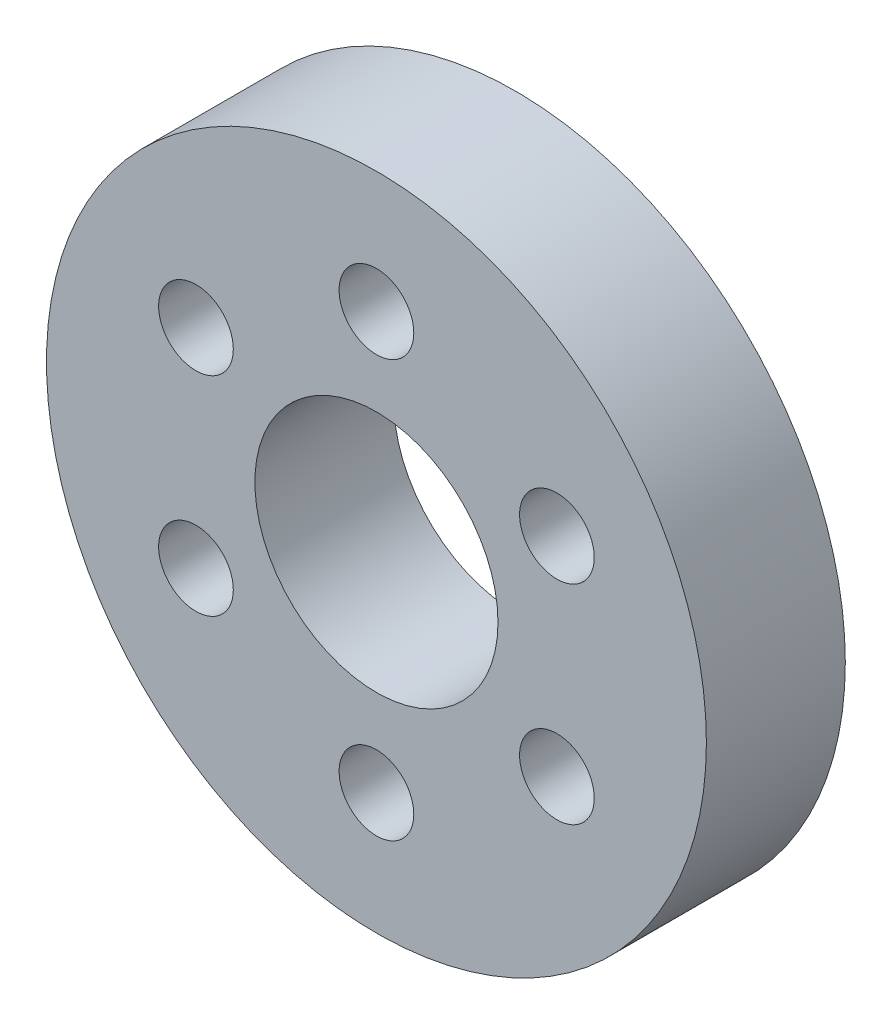
ISO-10303-21;
HEADER;
FILE_DESCRIPTION(('STEP AP214'),'2;1');
FILE_NAME('part.step','',(''),(''),'','','');
FILE_SCHEMA(('AUTOMOTIVE_DESIGN { 1 0 10303 214 1 1 1 1 }'));
ENDSEC;
DATA;
#1=APPLICATION_CONTEXT('core data for automotive mechanical design processes');
#2=APPLICATION_PROTOCOL_DEFINITION('international standard','automotive_design',2000,#1);
#3=PRODUCT_CONTEXT('',#1,'mechanical');
#4=PRODUCT('Part','Part','',(#3));
#5=PRODUCT_RELATED_PRODUCT_CATEGORY('part','',(#4));
#6=PRODUCT_DEFINITION_FORMATION('','',#4);
#7=PRODUCT_DEFINITION_CONTEXT('part definition',#1,'design');
#8=PRODUCT_DEFINITION('design','',#6,#7);
#9=PRODUCT_DEFINITION_SHAPE('','',#8);
#10=(LENGTH_UNIT() NAMED_UNIT(*) SI_UNIT(.MILLI.,.METRE.));
#11=(NAMED_UNIT(*) PLANE_ANGLE_UNIT() SI_UNIT($,.RADIAN.));
#12=(NAMED_UNIT(*) SI_UNIT($,.STERADIAN.) SOLID_ANGLE_UNIT());
#13=UNCERTAINTY_MEASURE_WITH_UNIT(LENGTH_MEASURE(1.E-05),#10,'distance_accuracy_value','');
#14=(GEOMETRIC_REPRESENTATION_CONTEXT(3) GLOBAL_UNCERTAINTY_ASSIGNED_CONTEXT((#13)) GLOBAL_UNIT_ASSIGNED_CONTEXT((#10,
#11,#12)) REPRESENTATION_CONTEXT('',''));
#15=CARTESIAN_POINT('',(0.,0.,0.));
#16=DIRECTION('',(0.,0.,1.));
#17=DIRECTION('',(1.,0.,0.));
#18=AXIS2_PLACEMENT_3D('',#15,#16,#17);
#19=CARTESIAN_POINT('',(0.,-1.48735469643318,8.));
#20=DIRECTION('',(0.,0.,1.));
#21=DIRECTION('',(1.,0.,0.));
#22=AXIS2_PLACEMENT_3D('',#19,#20,#21);
#23=PLANE('',#22);
#24=CARTESIAN_POINT('',(-10.3923048454133,-7.48735469643319,8.));
#25=DIRECTION('',(0.,0.,1.));
#26=DIRECTION('',(1.,0.,0.));
#27=AXIS2_PLACEMENT_3D('',#24,#25,#26);
#28=CIRCLE('',#27,2.14999999999954);
#29=CARTESIAN_POINT('',(-8.24230484541372,-7.48735469643319,8.));
#30=VERTEX_POINT('',#29);
#31=EDGE_CURVE('E78',#30,#30,#28,.T.);
#32=ORIENTED_EDGE('',*,*,#31,.F.);
#33=EDGE_LOOP('',(#32));
#34=FACE_BOUND('',#33,.T.);
#35=CARTESIAN_POINT('',(10.3923048454133,-7.48735469643318,8.));
#36=DIRECTION('',(0.,0.,1.));
#37=DIRECTION('',(1.,0.,0.));
#38=AXIS2_PLACEMENT_3D('',#35,#36,#37);
#39=CIRCLE('',#38,2.14999999999966);
#40=CARTESIAN_POINT('',(12.5423048454129,-7.48735469643318,8.));
#41=VERTEX_POINT('',#40);
#42=EDGE_CURVE('E69',#41,#41,#39,.T.);
#43=ORIENTED_EDGE('',*,*,#42,.F.);
#44=EDGE_LOOP('',(#43));
#45=FACE_BOUND('',#44,.T.);
#46=CARTESIAN_POINT('',(0.,10.5126453035668,8.));
#47=DIRECTION('',(0.,0.,1.));
#48=DIRECTION('',(1.,0.,0.));
#49=AXIS2_PLACEMENT_3D('',#46,#47,#48);
#50=CIRCLE('',#49,2.15);
#51=CARTESIAN_POINT('',(2.15,10.5126453035668,8.));
#52=VERTEX_POINT('',#51);
#53=EDGE_CURVE('E54',#52,#52,#50,.T.);
#54=ORIENTED_EDGE('',*,*,#53,.F.);
#55=EDGE_LOOP('',(#54));
#56=FACE_BOUND('',#55,.T.);
#57=CARTESIAN_POINT('',(0.,-1.48735469643318,8.));
#58=DIRECTION('',(0.,0.,1.));
#59=DIRECTION('',(1.,0.,0.));
#60=AXIS2_PLACEMENT_3D('',#57,#58,#59);
#61=CIRCLE('',#60,19.);
#62=CARTESIAN_POINT('',(19.,-1.48735469643318,8.));
#63=VERTEX_POINT('',#62);
#64=EDGE_CURVE('E10',#63,#63,#61,.T.);
#65=ORIENTED_EDGE('',*,*,#64,.T.);
#66=EDGE_LOOP('',(#65));
#67=FACE_BOUND('',#66,.T.);
#68=CARTESIAN_POINT('',(0.,-1.48735469643318,8.));
#69=DIRECTION('',(0.,0.,1.));
#70=DIRECTION('',(1.,0.,0.));
#71=AXIS2_PLACEMENT_3D('',#68,#69,#70);
#72=CIRCLE('',#71,7.);
#73=CARTESIAN_POINT('',(7.,-1.48735469643318,8.));
#74=VERTEX_POINT('',#73);
#75=EDGE_CURVE('E49',#74,#74,#72,.T.);
#76=ORIENTED_EDGE('',*,*,#75,.F.);
#77=EDGE_LOOP('',(#76));
#78=FACE_BOUND('',#77,.T.);
#79=CARTESIAN_POINT('',(10.3923048454134,4.51264530356709,8.));
#80=DIRECTION('',(0.,0.,1.));
#81=DIRECTION('',(1.,0.,0.));
#82=AXIS2_PLACEMENT_3D('',#79,#80,#81);
#83=CIRCLE('',#82,2.15);
#84=CARTESIAN_POINT('',(12.5423048454134,4.51264530356709,8.));
#85=VERTEX_POINT('',#84);
#86=EDGE_CURVE('E61',#85,#85,#83,.T.);
#87=ORIENTED_EDGE('',*,*,#86,.F.);
#88=EDGE_LOOP('',(#87));
#89=FACE_BOUND('',#88,.T.);
#90=CARTESIAN_POINT('',(0.,-13.4873546964332,8.));
#91=DIRECTION('',(0.,0.,1.));
#92=DIRECTION('',(1.,0.,0.));
#93=AXIS2_PLACEMENT_3D('',#90,#91,#92);
#94=CIRCLE('',#93,2.14999999999944);
#95=CARTESIAN_POINT('',(2.14999999999944,-13.4873546964332,8.));
#96=VERTEX_POINT('',#95);
#97=EDGE_CURVE('E71',#96,#96,#94,.T.);
#98=ORIENTED_EDGE('',*,*,#97,.F.);
#99=EDGE_LOOP('',(#98));
#100=FACE_BOUND('',#99,.T.);
#101=CARTESIAN_POINT('',(-10.392304845413,4.51264530356665,8.));
#102=DIRECTION('',(0.,0.,1.));
#103=DIRECTION('',(1.,0.,0.));
#104=AXIS2_PLACEMENT_3D('',#101,#102,#103);
#105=CIRCLE('',#104,2.15);
#106=CARTESIAN_POINT('',(-8.24230484541303,4.51264530356665,8.));
#107=VERTEX_POINT('',#106);
#108=EDGE_CURVE('E83',#107,#107,#105,.T.);
#109=ORIENTED_EDGE('',*,*,#108,.F.);
#110=EDGE_LOOP('',(#109));
#111=FACE_BOUND('',#110,.T.);
#112=ADVANCED_FACE('F39',(#34,#45,#56,#67,#78,#89,#100,#111),#23,.T.);
#113=CARTESIAN_POINT('',(0.,-1.48735469643318,0.));
#114=DIRECTION('',(0.,0.,1.));
#115=DIRECTION('',(1.,0.,0.));
#116=AXIS2_PLACEMENT_3D('',#113,#114,#115);
#117=PLANE('',#116);
#118=CARTESIAN_POINT('',(0.,-1.48735469643318,0.));
#119=DIRECTION('',(0.,0.,1.));
#120=DIRECTION('',(1.,0.,0.));
#121=AXIS2_PLACEMENT_3D('',#118,#119,#120);
#122=CIRCLE('',#121,19.);
#123=CARTESIAN_POINT('',(19.,-1.48735469643318,0.));
#124=VERTEX_POINT('',#123);
#125=EDGE_CURVE('E43',#124,#124,#122,.T.);
#126=ORIENTED_EDGE('',*,*,#125,.F.);
#127=EDGE_LOOP('',(#126));
#128=FACE_BOUND('',#127,.T.);
#129=CARTESIAN_POINT('',(0.,-1.48735469643318,0.));
#130=DIRECTION('',(0.,0.,1.));
#131=DIRECTION('',(1.,0.,0.));
#132=AXIS2_PLACEMENT_3D('',#129,#130,#131);
#133=CIRCLE('',#132,7.);
#134=CARTESIAN_POINT('',(7.,-1.48735469643318,0.));
#135=VERTEX_POINT('',#134);
#136=EDGE_CURVE('E55',#135,#135,#133,.T.);
#137=ORIENTED_EDGE('',*,*,#136,.T.);
#138=EDGE_LOOP('',(#137));
#139=FACE_BOUND('',#138,.T.);
#140=CARTESIAN_POINT('',(0.,10.5126453035668,0.));
#141=DIRECTION('',(0.,0.,1.));
#142=DIRECTION('',(1.,0.,0.));
#143=AXIS2_PLACEMENT_3D('',#140,#141,#142);
#144=CIRCLE('',#143,2.15);
#145=CARTESIAN_POINT('',(2.15,10.5126453035668,0.));
#146=VERTEX_POINT('',#145);
#147=EDGE_CURVE('E59',#146,#146,#144,.T.);
#148=ORIENTED_EDGE('',*,*,#147,.T.);
#149=EDGE_LOOP('',(#148));
#150=FACE_BOUND('',#149,.T.);
#151=CARTESIAN_POINT('',(10.3923048454134,4.51264530356709,0.));
#152=DIRECTION('',(0.,0.,1.));
#153=DIRECTION('',(1.,0.,0.));
#154=AXIS2_PLACEMENT_3D('',#151,#152,#153);
#155=CIRCLE('',#154,2.15);
#156=CARTESIAN_POINT('',(12.5423048454134,4.51264530356709,0.));
#157=VERTEX_POINT('',#156);
#158=EDGE_CURVE('E63',#157,#157,#155,.T.);
#159=ORIENTED_EDGE('',*,*,#158,.T.);
#160=EDGE_LOOP('',(#159));
#161=FACE_BOUND('',#160,.T.);
#162=CARTESIAN_POINT('',(10.3923048454133,-7.48735469643318,0.));
#163=DIRECTION('',(0.,0.,1.));
#164=DIRECTION('',(1.,0.,0.));
#165=AXIS2_PLACEMENT_3D('',#162,#163,#164);
#166=CIRCLE('',#165,2.14999999999966);
#167=CARTESIAN_POINT('',(12.5423048454129,-7.48735469643318,0.));
#168=VERTEX_POINT('',#167);
#169=EDGE_CURVE('E68',#168,#168,#166,.T.);
#170=ORIENTED_EDGE('',*,*,#169,.T.);
#171=EDGE_LOOP('',(#170));
#172=FACE_BOUND('',#171,.T.);
#173=CARTESIAN_POINT('',(0.,-13.4873546964332,0.));
#174=DIRECTION('',(0.,0.,1.));
#175=DIRECTION('',(1.,0.,0.));
#176=AXIS2_PLACEMENT_3D('',#173,#174,#175);
#177=CIRCLE('',#176,2.14999999999944);
#178=CARTESIAN_POINT('',(2.14999999999944,-13.4873546964332,0.));
#179=VERTEX_POINT('',#178);
#180=EDGE_CURVE('E76',#179,#179,#177,.T.);
#181=ORIENTED_EDGE('',*,*,#180,.T.);
#182=EDGE_LOOP('',(#181));
#183=FACE_BOUND('',#182,.T.);
#184=CARTESIAN_POINT('',(-10.3923048454133,-7.48735469643319,0.));
#185=DIRECTION('',(0.,0.,1.));
#186=DIRECTION('',(1.,0.,0.));
#187=AXIS2_PLACEMENT_3D('',#184,#185,#186);
#188=CIRCLE('',#187,2.14999999999954);
#189=CARTESIAN_POINT('',(-8.24230484541372,-7.48735469643319,0.));
#190=VERTEX_POINT('',#189);
#191=EDGE_CURVE('E84',#190,#190,#188,.T.);
#192=ORIENTED_EDGE('',*,*,#191,.T.);
#193=EDGE_LOOP('',(#192));
#194=FACE_BOUND('',#193,.T.);
#195=CARTESIAN_POINT('',(-10.392304845413,4.51264530356665,0.));
#196=DIRECTION('',(0.,0.,1.));
#197=DIRECTION('',(1.,0.,0.));
#198=AXIS2_PLACEMENT_3D('',#195,#196,#197);
#199=CIRCLE('',#198,2.15);
#200=CARTESIAN_POINT('',(-8.24230484541303,4.51264530356665,0.));
#201=VERTEX_POINT('',#200);
#202=EDGE_CURVE('E86',#201,#201,#199,.T.);
#203=ORIENTED_EDGE('',*,*,#202,.T.);
#204=EDGE_LOOP('',(#203));
#205=FACE_BOUND('',#204,.T.);
#206=ADVANCED_FACE('F98',(#128,#139,#150,#161,#172,#183,#194,#205),#117,.F.);
#207=CARTESIAN_POINT('',(0.,-1.48735469643318,8.));
#208=DIRECTION('',(0.,0.,-1.));
#209=DIRECTION('',(-1.,0.,0.));
#210=AXIS2_PLACEMENT_3D('',#207,#208,#209);
#211=CYLINDRICAL_SURFACE('',#210,19.);
#212=ORIENTED_EDGE('',*,*,#64,.F.);
#213=EDGE_LOOP('',(#212));
#214=FACE_BOUND('',#213,.T.);
#215=ORIENTED_EDGE('',*,*,#125,.T.);
#216=EDGE_LOOP('',(#215));
#217=FACE_BOUND('',#216,.T.);
#218=ADVANCED_FACE('F41',(#214,#217),#211,.T.);
#219=CARTESIAN_POINT('',(0.,-1.48735469643318,8.));
#220=DIRECTION('',(0.,0.,-1.));
#221=DIRECTION('',(-1.,0.,0.));
#222=AXIS2_PLACEMENT_3D('',#219,#220,#221);
#223=CYLINDRICAL_SURFACE('',#222,7.);
#224=ORIENTED_EDGE('',*,*,#75,.T.);
#225=EDGE_LOOP('',(#224));
#226=FACE_BOUND('',#225,.T.);
#227=ORIENTED_EDGE('',*,*,#136,.F.);
#228=EDGE_LOOP('',(#227));
#229=FACE_BOUND('',#228,.T.);
#230=ADVANCED_FACE('F107',(#226,#229),#223,.F.);
#231=CARTESIAN_POINT('',(0.,10.5126453035668,8.));
#232=DIRECTION('',(0.,0.,-1.));
#233=DIRECTION('',(-1.,0.,0.));
#234=AXIS2_PLACEMENT_3D('',#231,#232,#233);
#235=CYLINDRICAL_SURFACE('',#234,2.15);
#236=ORIENTED_EDGE('',*,*,#53,.T.);
#237=EDGE_LOOP('',(#236));
#238=FACE_BOUND('',#237,.T.);
#239=ORIENTED_EDGE('',*,*,#147,.F.);
#240=EDGE_LOOP('',(#239));
#241=FACE_BOUND('',#240,.T.);
#242=ADVANCED_FACE('F112',(#238,#241),#235,.F.);
#243=CARTESIAN_POINT('',(10.3923048454134,4.51264530356709,8.));
#244=DIRECTION('',(0.,0.,-1.));
#245=DIRECTION('',(-1.,0.,0.));
#246=AXIS2_PLACEMENT_3D('',#243,#244,#245);
#247=CYLINDRICAL_SURFACE('',#246,2.15);
#248=ORIENTED_EDGE('',*,*,#86,.T.);
#249=EDGE_LOOP('',(#248));
#250=FACE_BOUND('',#249,.T.);
#251=ORIENTED_EDGE('',*,*,#158,.F.);
#252=EDGE_LOOP('',(#251));
#253=FACE_BOUND('',#252,.T.);
#254=ADVANCED_FACE('F113',(#250,#253),#247,.F.);
#255=CARTESIAN_POINT('',(10.3923048454133,-7.48735469643318,8.));
#256=DIRECTION('',(0.,0.,-1.));
#257=DIRECTION('',(-1.,0.,0.));
#258=AXIS2_PLACEMENT_3D('',#255,#256,#257);
#259=CYLINDRICAL_SURFACE('',#258,2.14999999999966);
#260=ORIENTED_EDGE('',*,*,#42,.T.);
#261=EDGE_LOOP('',(#260));
#262=FACE_BOUND('',#261,.T.);
#263=ORIENTED_EDGE('',*,*,#169,.F.);
#264=EDGE_LOOP('',(#263));
#265=FACE_BOUND('',#264,.T.);
#266=ADVANCED_FACE('F118',(#262,#265),#259,.F.);
#267=CARTESIAN_POINT('',(0.,-13.4873546964332,8.));
#268=DIRECTION('',(0.,0.,-1.));
#269=DIRECTION('',(-1.,0.,0.));
#270=AXIS2_PLACEMENT_3D('',#267,#268,#269);
#271=CYLINDRICAL_SURFACE('',#270,2.14999999999944);
#272=ORIENTED_EDGE('',*,*,#97,.T.);
#273=EDGE_LOOP('',(#272));
#274=FACE_BOUND('',#273,.T.);
#275=ORIENTED_EDGE('',*,*,#180,.F.);
#276=EDGE_LOOP('',(#275));
#277=FACE_BOUND('',#276,.T.);
#278=ADVANCED_FACE('F125',(#274,#277),#271,.F.);
#279=CARTESIAN_POINT('',(-10.3923048454133,-7.48735469643319,8.));
#280=DIRECTION('',(0.,0.,-1.));
#281=DIRECTION('',(-1.,0.,0.));
#282=AXIS2_PLACEMENT_3D('',#279,#280,#281);
#283=CYLINDRICAL_SURFACE('',#282,2.14999999999954);
#284=ORIENTED_EDGE('',*,*,#31,.T.);
#285=EDGE_LOOP('',(#284));
#286=FACE_BOUND('',#285,.T.);
#287=ORIENTED_EDGE('',*,*,#191,.F.);
#288=EDGE_LOOP('',(#287));
#289=FACE_BOUND('',#288,.T.);
#290=ADVANCED_FACE('F130',(#286,#289),#283,.F.);
#291=CARTESIAN_POINT('',(-10.392304845413,4.51264530356665,8.));
#292=DIRECTION('',(0.,0.,-1.));
#293=DIRECTION('',(-1.,0.,0.));
#294=AXIS2_PLACEMENT_3D('',#291,#292,#293);
#295=CYLINDRICAL_SURFACE('',#294,2.15);
#296=ORIENTED_EDGE('',*,*,#108,.T.);
#297=EDGE_LOOP('',(#296));
#298=FACE_BOUND('',#297,.T.);
#299=ORIENTED_EDGE('',*,*,#202,.F.);
#300=EDGE_LOOP('',(#299));
#301=FACE_BOUND('',#300,.T.);
#302=ADVANCED_FACE('F94',(#298,#301),#295,.F.);
#303=CLOSED_SHELL('',(#112,#206,#218,#230,#242,#254,#266,#278,#290,#302));
#304=MANIFOLD_SOLID_BREP('B2',#303);
#305=ADVANCED_BREP_SHAPE_REPRESENTATION('',(#18,#304),#14);
#306=SHAPE_DEFINITION_REPRESENTATION(#9,#305);
ENDSEC;
END-ISO-10303-21;
